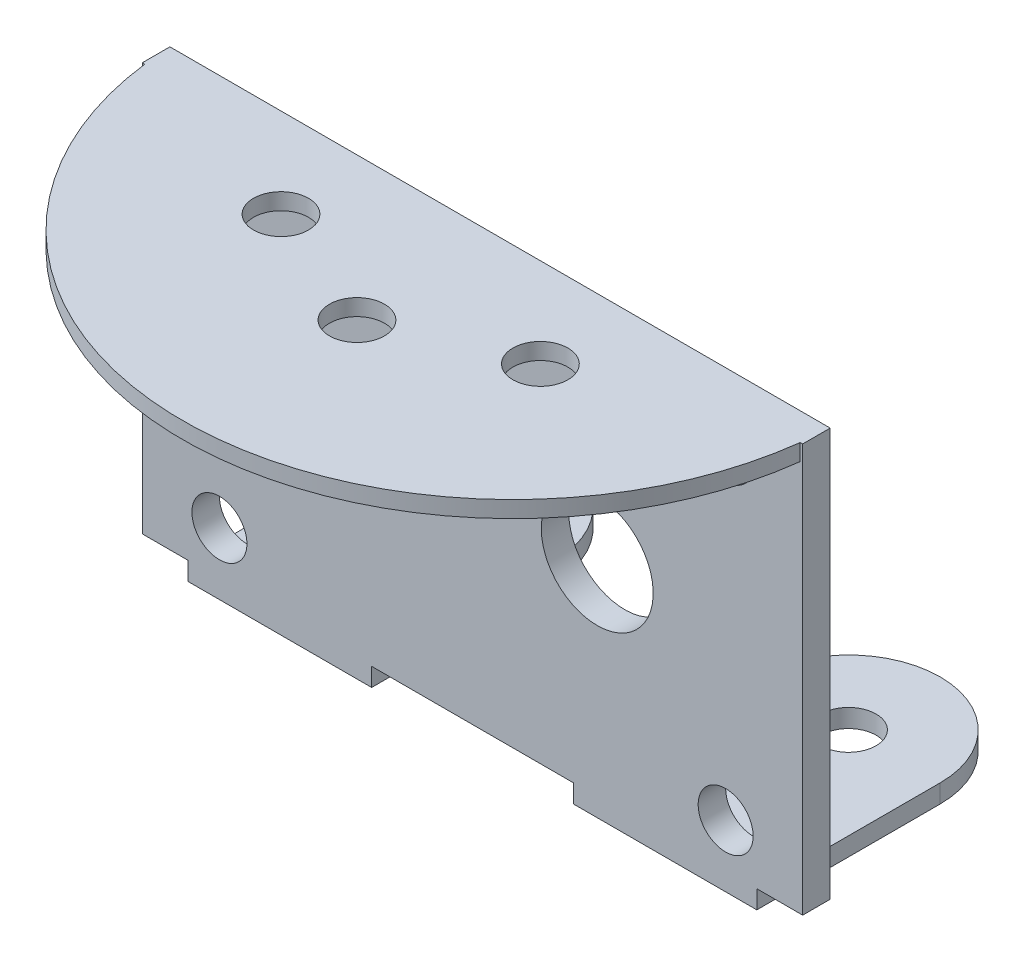
ISO-10303-21;
HEADER;
FILE_DESCRIPTION(('STEP AP214'),'2;1');
FILE_NAME('part.step','',(''),(''),'','','');
FILE_SCHEMA(('AUTOMOTIVE_DESIGN { 1 0 10303 214 1 1 1 1 }'));
ENDSEC;
DATA;
#1=APPLICATION_CONTEXT('core data for automotive mechanical design processes');
#2=APPLICATION_PROTOCOL_DEFINITION('international standard','automotive_design',2000,#1);
#3=PRODUCT_CONTEXT('',#1,'mechanical');
#4=PRODUCT('Part','Part','',(#3));
#5=PRODUCT_RELATED_PRODUCT_CATEGORY('part','',(#4));
#6=PRODUCT_DEFINITION_FORMATION('','',#4);
#7=PRODUCT_DEFINITION_CONTEXT('part definition',#1,'design');
#8=PRODUCT_DEFINITION('design','',#6,#7);
#9=PRODUCT_DEFINITION_SHAPE('','',#8);
#10=(LENGTH_UNIT() NAMED_UNIT(*) SI_UNIT(.MILLI.,.METRE.));
#11=(NAMED_UNIT(*) PLANE_ANGLE_UNIT() SI_UNIT($,.RADIAN.));
#12=(NAMED_UNIT(*) SI_UNIT($,.STERADIAN.) SOLID_ANGLE_UNIT());
#13=UNCERTAINTY_MEASURE_WITH_UNIT(LENGTH_MEASURE(1.E-05),#10,'distance_accuracy_value','');
#14=(GEOMETRIC_REPRESENTATION_CONTEXT(3) GLOBAL_UNCERTAINTY_ASSIGNED_CONTEXT((#13)) GLOBAL_UNIT_ASSIGNED_CONTEXT((#10,
#11,#12)) REPRESENTATION_CONTEXT('',''));
#15=CARTESIAN_POINT('',(0.,0.,0.));
#16=DIRECTION('',(0.,0.,1.));
#17=DIRECTION('',(1.,0.,0.));
#18=AXIS2_PLACEMENT_3D('',#15,#16,#17);
#19=CARTESIAN_POINT('',(13.8,8.74499999999999,1.5));
#20=DIRECTION('',(0.,0.,-1.));
#21=DIRECTION('',(-1.,0.,0.));
#22=AXIS2_PLACEMENT_3D('',#19,#20,#21);
#23=CYLINDRICAL_SURFACE('',#22,1.5);
#24=CARTESIAN_POINT('',(13.8,8.74499999999999,1.5));
#25=DIRECTION('',(0.,0.,1.));
#26=DIRECTION('',(1.,0.,0.));
#27=AXIS2_PLACEMENT_3D('',#24,#25,#26);
#28=CIRCLE('',#27,1.5);
#29=CARTESIAN_POINT('',(13.5558688876854,10.225,1.5));
#30=VERTEX_POINT('',#29);
#31=CARTESIAN_POINT('',(14.0441311123146,10.225,1.5));
#32=VERTEX_POINT('',#31);
#33=EDGE_CURVE('E323',#30,#32,#28,.T.);
#34=ORIENTED_EDGE('',*,*,#33,.T.);
#35=DIRECTION('',(0.,0.,-1.));
#36=VECTOR('',#35,1.);
#37=CARTESIAN_POINT('',(14.0441311123146,10.225,1.5));
#38=LINE('',#37,#36);
#39=CARTESIAN_POINT('',(14.0441311123146,10.225,0.));
#40=VERTEX_POINT('',#39);
#41=EDGE_CURVE('E209',#32,#40,#38,.T.);
#42=ORIENTED_EDGE('',*,*,#41,.T.);
#43=CARTESIAN_POINT('',(13.8,8.74499999999999,0.));
#44=DIRECTION('',(0.,0.,1.));
#45=DIRECTION('',(1.,0.,0.));
#46=AXIS2_PLACEMENT_3D('',#43,#44,#45);
#47=CIRCLE('',#46,1.5);
#48=CARTESIAN_POINT('',(13.5558688876854,10.225,0.));
#49=VERTEX_POINT('',#48);
#50=EDGE_CURVE('E320',#49,#40,#47,.T.);
#51=ORIENTED_EDGE('',*,*,#50,.F.);
#52=DIRECTION('',(0.,0.,-1.));
#53=VECTOR('',#52,1.);
#54=CARTESIAN_POINT('',(13.5558688876854,10.225,1.5));
#55=LINE('',#54,#53);
#56=EDGE_CURVE('E204',#49,#30,#55,.F.);
#57=ORIENTED_EDGE('',*,*,#56,.T.);
#58=EDGE_LOOP('',(#34,#42,#51,#57));
#59=FACE_BOUND('',#58,.T.);
#60=ADVANCED_FACE('F39',(#59),#23,.F.);
#61=CARTESIAN_POINT('',(-13.8,8.74499999999999,1.5));
#62=DIRECTION('',(0.,0.,-1.));
#63=DIRECTION('',(-1.,0.,0.));
#64=AXIS2_PLACEMENT_3D('',#61,#62,#63);
#65=CYLINDRICAL_SURFACE('',#64,1.5);
#66=CARTESIAN_POINT('',(-13.8,8.74499999999999,1.5));
#67=DIRECTION('',(0.,0.,1.));
#68=DIRECTION('',(-1.,0.,0.));
#69=AXIS2_PLACEMENT_3D('',#66,#67,#68);
#70=CIRCLE('',#69,1.5);
#71=CARTESIAN_POINT('',(-14.0441311123146,10.225,1.5));
#72=VERTEX_POINT('',#71);
#73=CARTESIAN_POINT('',(-13.5558688876854,10.225,1.5));
#74=VERTEX_POINT('',#73);
#75=EDGE_CURVE('E200',#72,#74,#70,.T.);
#76=ORIENTED_EDGE('',*,*,#75,.T.);
#77=DIRECTION('',(0.,0.,-1.));
#78=VECTOR('',#77,1.);
#79=CARTESIAN_POINT('',(-13.5558688876854,10.225,1.5));
#80=LINE('',#79,#78);
#81=CARTESIAN_POINT('',(-13.5558688876854,10.225,0.));
#82=VERTEX_POINT('',#81);
#83=EDGE_CURVE('E11',#74,#82,#80,.T.);
#84=ORIENTED_EDGE('',*,*,#83,.T.);
#85=CARTESIAN_POINT('',(-13.8,8.74499999999999,0.));
#86=DIRECTION('',(0.,0.,1.));
#87=DIRECTION('',(-1.,0.,0.));
#88=AXIS2_PLACEMENT_3D('',#85,#86,#87);
#89=CIRCLE('',#88,1.5);
#90=CARTESIAN_POINT('',(-14.0441311123146,10.225,0.));
#91=VERTEX_POINT('',#90);
#92=EDGE_CURVE('E298',#91,#82,#89,.T.);
#93=ORIENTED_EDGE('',*,*,#92,.F.);
#94=DIRECTION('',(0.,0.,-1.));
#95=VECTOR('',#94,1.);
#96=CARTESIAN_POINT('',(-14.0441311123146,10.225,1.5));
#97=LINE('',#96,#95);
#98=EDGE_CURVE('E47',#91,#72,#97,.F.);
#99=ORIENTED_EDGE('',*,*,#98,.T.);
#100=EDGE_LOOP('',(#76,#84,#93,#99));
#101=FACE_BOUND('',#100,.T.);
#102=ADVANCED_FACE('F405',(#101),#65,.F.);
#103=CARTESIAN_POINT('',(-18.,-11.125,1.5));
#104=DIRECTION('',(0.,1.,0.));
#105=DIRECTION('',(-1.,0.,0.));
#106=AXIS2_PLACEMENT_3D('',#103,#104,#105);
#107=PLANE('',#106);
#108=DIRECTION('',(0.,0.,1.));
#109=VECTOR('',#108,1.);
#110=CARTESIAN_POINT('',(15.5,-11.125,0.));
#111=LINE('',#110,#109);
#112=CARTESIAN_POINT('',(15.5,-11.125,0.));
#113=VERTEX_POINT('',#112);
#114=CARTESIAN_POINT('',(15.5,-11.125,1.5));
#115=VERTEX_POINT('',#114);
#116=EDGE_CURVE('E244',#113,#115,#111,.T.);
#117=ORIENTED_EDGE('',*,*,#116,.F.);
#118=DIRECTION('',(1.,0.,0.));
#119=VECTOR('',#118,1.);
#120=CARTESIAN_POINT('',(-18.,-11.125,0.));
#121=LINE('',#120,#119);
#122=CARTESIAN_POINT('',(18.,-11.125,0.));
#123=VERTEX_POINT('',#122);
#124=EDGE_CURVE('E348',#113,#123,#121,.T.);
#125=ORIENTED_EDGE('',*,*,#124,.T.);
#126=DIRECTION('',(0.,0.,-1.));
#127=VECTOR('',#126,1.);
#128=CARTESIAN_POINT('',(18.,-11.125,1.5));
#129=LINE('',#128,#127);
#130=CARTESIAN_POINT('',(18.,-11.125,1.5));
#131=VERTEX_POINT('',#130);
#132=EDGE_CURVE('E340',#131,#123,#129,.T.);
#133=ORIENTED_EDGE('',*,*,#132,.F.);
#134=DIRECTION('',(1.,0.,0.));
#135=VECTOR('',#134,1.);
#136=CARTESIAN_POINT('',(-18.,-11.125,1.5));
#137=LINE('',#136,#135);
#138=EDGE_CURVE('E62',#115,#131,#137,.T.);
#139=ORIENTED_EDGE('',*,*,#138,.F.);
#140=EDGE_LOOP('',(#117,#125,#133,#139));
#141=FACE_BOUND('',#140,.T.);
#142=ADVANCED_FACE('F410',(#141),#107,.F.);
#143=CARTESIAN_POINT('',(-5.49999999999999,-11.125,0.));
#144=VERTEX_POINT('',#143);
#145=CARTESIAN_POINT('',(5.50000000000001,-11.125,0.));
#146=VERTEX_POINT('',#145);
#147=EDGE_CURVE('E797',#144,#146,#121,.T.);
#148=ORIENTED_EDGE('',*,*,#147,.T.);
#149=DIRECTION('',(0.,0.,1.));
#150=VECTOR('',#149,1.);
#151=CARTESIAN_POINT('',(5.50000000000001,-11.125,0.));
#152=LINE('',#151,#150);
#153=CARTESIAN_POINT('',(5.50000000000001,-11.125,1.5));
#154=VERTEX_POINT('',#153);
#155=EDGE_CURVE('E237',#146,#154,#152,.T.);
#156=ORIENTED_EDGE('',*,*,#155,.T.);
#157=CARTESIAN_POINT('',(-5.49999999999999,-11.125,1.5));
#158=VERTEX_POINT('',#157);
#159=EDGE_CURVE('E341',#158,#154,#137,.T.);
#160=ORIENTED_EDGE('',*,*,#159,.F.);
#161=DIRECTION('',(0.,0.,1.));
#162=VECTOR('',#161,1.);
#163=CARTESIAN_POINT('',(-5.49999999999999,-11.125,0.));
#164=LINE('',#163,#162);
#165=EDGE_CURVE('E279',#144,#158,#164,.T.);
#166=ORIENTED_EDGE('',*,*,#165,.F.);
#167=EDGE_LOOP('',(#148,#156,#160,#166));
#168=FACE_BOUND('',#167,.T.);
#169=ADVANCED_FACE('F419',(#168),#107,.F.);
#170=CARTESIAN_POINT('',(0.,0.,1.5));
#171=DIRECTION('',(0.,0.,-1.));
#172=DIRECTION('',(-1.,0.,0.));
#173=AXIS2_PLACEMENT_3D('',#170,#171,#172);
#174=PLANE('',#173);
#175=CARTESIAN_POINT('',(13.8,-8.74499999999999,1.5));
#176=DIRECTION('',(0.,0.,1.));
#177=DIRECTION('',(-1.,0.,0.));
#178=AXIS2_PLACEMENT_3D('',#175,#176,#177);
#179=CIRCLE('',#178,1.5);
#180=CARTESIAN_POINT('',(12.3,-8.74499999999999,1.5));
#181=VERTEX_POINT('',#180);
#182=EDGE_CURVE('E317',#181,#181,#179,.T.);
#183=ORIENTED_EDGE('',*,*,#182,.F.);
#184=EDGE_LOOP('',(#183));
#185=FACE_BOUND('',#184,.T.);
#186=CARTESIAN_POINT('',(6.80000000000002,0.,1.5));
#187=DIRECTION('',(0.,0.,1.));
#188=DIRECTION('',(-1.,0.,0.));
#189=AXIS2_PLACEMENT_3D('',#186,#187,#188);
#190=CIRCLE('',#189,3.05);
#191=CARTESIAN_POINT('',(3.75000000000002,0.,1.5));
#192=VERTEX_POINT('',#191);
#193=EDGE_CURVE('E311',#192,#192,#190,.T.);
#194=ORIENTED_EDGE('',*,*,#193,.F.);
#195=EDGE_LOOP('',(#194));
#196=FACE_BOUND('',#195,.T.);
#197=CARTESIAN_POINT('',(-13.8,-8.745,1.5));
#198=DIRECTION('',(0.,0.,1.));
#199=DIRECTION('',(1.,0.,0.));
#200=AXIS2_PLACEMENT_3D('',#197,#198,#199);
#201=CIRCLE('',#200,1.5);
#202=CARTESIAN_POINT('',(-12.3,-8.745,1.5));
#203=VERTEX_POINT('',#202);
#204=EDGE_CURVE('E305',#203,#203,#201,.T.);
#205=ORIENTED_EDGE('',*,*,#204,.F.);
#206=EDGE_LOOP('',(#205));
#207=FACE_BOUND('',#206,.T.);
#208=DIRECTION('',(1.,0.,0.));
#209=VECTOR('',#208,1.);
#210=CARTESIAN_POINT('',(0.,10.225,1.5));
#211=LINE('',#210,#209);
#212=CARTESIAN_POINT('',(-17.8650496780726,10.225,1.5));
#213=VERTEX_POINT('',#212);
#214=EDGE_CURVE('E54',#213,#72,#211,.T.);
#215=ORIENTED_EDGE('',*,*,#214,.F.);
#216=DIRECTION('',(0.,1.,0.));
#217=VECTOR('',#216,1.);
#218=CARTESIAN_POINT('',(-17.8650496780726,10.225,1.5));
#219=LINE('',#218,#217);
#220=CARTESIAN_POINT('',(-17.8650496780726,11.125,1.5));
#221=VERTEX_POINT('',#220);
#222=EDGE_CURVE('E178',#213,#221,#219,.T.);
#223=ORIENTED_EDGE('',*,*,#222,.T.);
#224=DIRECTION('',(-1.,0.,0.));
#225=VECTOR('',#224,1.);
#226=CARTESIAN_POINT('',(-18.,11.125,1.5));
#227=LINE('',#226,#225);
#228=CARTESIAN_POINT('',(-18.,11.125,1.5));
#229=VERTEX_POINT('',#228);
#230=EDGE_CURVE('E330',#221,#229,#227,.T.);
#231=ORIENTED_EDGE('',*,*,#230,.T.);
#232=DIRECTION('',(0.,-1.,0.));
#233=VECTOR('',#232,1.);
#234=CARTESIAN_POINT('',(-18.,-11.125,1.5));
#235=LINE('',#234,#233);
#236=CARTESIAN_POINT('',(-18.,-11.125,1.5));
#237=VERTEX_POINT('',#236);
#238=EDGE_CURVE('E335',#229,#237,#235,.T.);
#239=ORIENTED_EDGE('',*,*,#238,.T.);
#240=CARTESIAN_POINT('',(-15.5,-11.125,1.5));
#241=VERTEX_POINT('',#240);
#242=EDGE_CURVE('E337',#237,#241,#137,.T.);
#243=ORIENTED_EDGE('',*,*,#242,.T.);
#244=DIRECTION('',(0.,1.,0.));
#245=VECTOR('',#244,1.);
#246=CARTESIAN_POINT('',(-15.5,-12.125,1.5));
#247=LINE('',#246,#245);
#248=CARTESIAN_POINT('',(-15.5,-12.125,1.5));
#249=VERTEX_POINT('',#248);
#250=EDGE_CURVE('E286',#249,#241,#247,.T.);
#251=ORIENTED_EDGE('',*,*,#250,.F.);
#252=DIRECTION('',(-1.,0.,0.));
#253=VECTOR('',#252,1.);
#254=CARTESIAN_POINT('',(0.,-12.125,1.5));
#255=LINE('',#254,#253);
#256=CARTESIAN_POINT('',(-5.49999999999999,-12.125,1.5));
#257=VERTEX_POINT('',#256);
#258=EDGE_CURVE('E264',#257,#249,#255,.T.);
#259=ORIENTED_EDGE('',*,*,#258,.F.);
#260=DIRECTION('',(0.,1.,0.));
#261=VECTOR('',#260,1.);
#262=CARTESIAN_POINT('',(-5.49999999999999,-12.125,1.5));
#263=LINE('',#262,#261);
#264=EDGE_CURVE('E289',#257,#158,#263,.T.);
#265=ORIENTED_EDGE('',*,*,#264,.T.);
#266=ORIENTED_EDGE('',*,*,#159,.T.);
#267=DIRECTION('',(0.,1.,0.));
#268=VECTOR('',#267,1.);
#269=CARTESIAN_POINT('',(5.50000000000001,-12.125,1.5));
#270=LINE('',#269,#268);
#271=CARTESIAN_POINT('',(5.50000000000001,-12.125,1.5));
#272=VERTEX_POINT('',#271);
#273=EDGE_CURVE('E234',#272,#154,#270,.T.);
#274=ORIENTED_EDGE('',*,*,#273,.F.);
#275=DIRECTION('',(-1.,0.,0.));
#276=VECTOR('',#275,1.);
#277=CARTESIAN_POINT('',(0.,-12.125,1.5));
#278=LINE('',#277,#276);
#279=CARTESIAN_POINT('',(15.5,-12.125,1.5));
#280=VERTEX_POINT('',#279);
#281=EDGE_CURVE('E232',#280,#272,#278,.T.);
#282=ORIENTED_EDGE('',*,*,#281,.F.);
#283=DIRECTION('',(0.,1.,0.));
#284=VECTOR('',#283,1.);
#285=CARTESIAN_POINT('',(15.5,-12.125,1.5));
#286=LINE('',#285,#284);
#287=EDGE_CURVE('E249',#280,#115,#286,.T.);
#288=ORIENTED_EDGE('',*,*,#287,.T.);
#289=ORIENTED_EDGE('',*,*,#138,.T.);
#290=DIRECTION('',(0.,1.,0.));
#291=VECTOR('',#290,1.);
#292=CARTESIAN_POINT('',(18.,-11.125,1.5));
#293=LINE('',#292,#291);
#294=CARTESIAN_POINT('',(18.,11.125,1.5));
#295=VERTEX_POINT('',#294);
#296=EDGE_CURVE('E327',#131,#295,#293,.T.);
#297=ORIENTED_EDGE('',*,*,#296,.T.);
#298=CARTESIAN_POINT('',(17.8650496780725,11.125,1.5));
#299=VERTEX_POINT('',#298);
#300=EDGE_CURVE('E332',#295,#299,#227,.T.);
#301=ORIENTED_EDGE('',*,*,#300,.T.);
#302=DIRECTION('',(0.,1.,0.));
#303=VECTOR('',#302,1.);
#304=CARTESIAN_POINT('',(17.8650496780725,10.225,1.5));
#305=LINE('',#304,#303);
#306=CARTESIAN_POINT('',(17.8650496780725,10.225,1.5));
#307=VERTEX_POINT('',#306);
#308=EDGE_CURVE('E187',#299,#307,#305,.F.);
#309=ORIENTED_EDGE('',*,*,#308,.T.);
#310=EDGE_CURVE('E191',#32,#307,#211,.T.);
#311=ORIENTED_EDGE('',*,*,#310,.F.);
#312=ORIENTED_EDGE('',*,*,#33,.F.);
#313=EDGE_CURVE('E201',#74,#30,#211,.T.);
#314=ORIENTED_EDGE('',*,*,#313,.F.);
#315=ORIENTED_EDGE('',*,*,#75,.F.);
#316=EDGE_LOOP('',(#215,#223,#231,#239,#243,#251,#259,#265,#266,#274,#282,#288,#289,#297,#301,
#309,#311,#312,#314,#315));
#317=FACE_BOUND('',#316,.T.);
#318=CARTESIAN_POINT('',(-4.19999999999998,0.,1.5));
#319=DIRECTION('',(0.,0.,1.));
#320=DIRECTION('',(-1.,0.,0.));
#321=AXIS2_PLACEMENT_3D('',#318,#319,#320);
#322=CIRCLE('',#321,1.875);
#323=CARTESIAN_POINT('',(-6.07499999999998,0.,1.5));
#324=VERTEX_POINT('',#323);
#325=EDGE_CURVE('E295',#324,#324,#322,.T.);
#326=ORIENTED_EDGE('',*,*,#325,.F.);
#327=EDGE_LOOP('',(#326));
#328=FACE_BOUND('',#327,.T.);
#329=ADVANCED_FACE('F196',(#185,#196,#207,#317,#328),#174,.F.);
#330=CARTESIAN_POINT('',(0.,0.,0.));
#331=DIRECTION('',(0.,0.,-1.));
#332=DIRECTION('',(-1.,0.,0.));
#333=AXIS2_PLACEMENT_3D('',#330,#331,#332);
#334=PLANE('',#333);
#335=DIRECTION('',(0.,-1.,0.));
#336=VECTOR('',#335,1.);
#337=CARTESIAN_POINT('',(-18.,-11.125,0.));
#338=LINE('',#337,#336);
#339=CARTESIAN_POINT('',(-18.,11.125,0.));
#340=VERTEX_POINT('',#339);
#341=CARTESIAN_POINT('',(-18.,-11.125,0.));
#342=VERTEX_POINT('',#341);
#343=EDGE_CURVE('E346',#340,#342,#338,.T.);
#344=ORIENTED_EDGE('',*,*,#343,.F.);
#345=DIRECTION('',(-1.,0.,0.));
#346=VECTOR('',#345,1.);
#347=CARTESIAN_POINT('',(-18.,11.125,0.));
#348=LINE('',#347,#346);
#349=CARTESIAN_POINT('',(18.,11.125,0.));
#350=VERTEX_POINT('',#349);
#351=EDGE_CURVE('E344',#350,#340,#348,.T.);
#352=ORIENTED_EDGE('',*,*,#351,.F.);
#353=DIRECTION('',(0.,1.,0.));
#354=VECTOR('',#353,1.);
#355=CARTESIAN_POINT('',(18.,-11.125,0.));
#356=LINE('',#355,#354);
#357=EDGE_CURVE('E325',#123,#350,#356,.T.);
#358=ORIENTED_EDGE('',*,*,#357,.F.);
#359=ORIENTED_EDGE('',*,*,#124,.F.);
#360=EDGE_CURVE('E793',#146,#113,#121,.T.);
#361=ORIENTED_EDGE('',*,*,#360,.F.);
#362=ORIENTED_EDGE('',*,*,#147,.F.);
#363=CARTESIAN_POINT('',(-15.5,-11.125,0.));
#364=VERTEX_POINT('',#363);
#365=EDGE_CURVE('E351',#364,#144,#121,.T.);
#366=ORIENTED_EDGE('',*,*,#365,.F.);
#367=EDGE_CURVE('E331',#342,#364,#121,.T.);
#368=ORIENTED_EDGE('',*,*,#367,.F.);
#369=EDGE_LOOP('',(#344,#352,#358,#359,#361,#362,#366,#368));
#370=FACE_BOUND('',#369,.T.);
#371=DIRECTION('',(-1.,0.,0.));
#372=VECTOR('',#371,1.);
#373=CARTESIAN_POINT('',(0.,10.225,0.));
#374=LINE('',#373,#372);
#375=EDGE_CURVE('E192',#82,#91,#374,.T.);
#376=ORIENTED_EDGE('',*,*,#375,.T.);
#377=ORIENTED_EDGE('',*,*,#92,.T.);
#378=EDGE_LOOP('',(#376,#377));
#379=FACE_BOUND('',#378,.T.);
#380=EDGE_CURVE('E202',#40,#49,#374,.T.);
#381=ORIENTED_EDGE('',*,*,#380,.T.);
#382=ORIENTED_EDGE('',*,*,#50,.T.);
#383=EDGE_LOOP('',(#381,#382));
#384=FACE_BOUND('',#383,.T.);
#385=CARTESIAN_POINT('',(6.80000000000002,0.,0.));
#386=DIRECTION('',(0.,0.,1.));
#387=DIRECTION('',(-1.,0.,0.));
#388=AXIS2_PLACEMENT_3D('',#385,#386,#387);
#389=CIRCLE('',#388,3.05);
#390=CARTESIAN_POINT('',(3.75000000000002,0.,0.));
#391=VERTEX_POINT('',#390);
#392=EDGE_CURVE('E308',#391,#391,#389,.T.);
#393=ORIENTED_EDGE('',*,*,#392,.T.);
#394=EDGE_LOOP('',(#393));
#395=FACE_BOUND('',#394,.T.);
#396=CARTESIAN_POINT('',(13.8,-8.74499999999999,0.));
#397=DIRECTION('',(0.,0.,1.));
#398=DIRECTION('',(-1.,0.,0.));
#399=AXIS2_PLACEMENT_3D('',#396,#397,#398);
#400=CIRCLE('',#399,1.5);
#401=CARTESIAN_POINT('',(12.3,-8.74499999999999,0.));
#402=VERTEX_POINT('',#401);
#403=EDGE_CURVE('E314',#402,#402,#400,.T.);
#404=ORIENTED_EDGE('',*,*,#403,.T.);
#405=EDGE_LOOP('',(#404));
#406=FACE_BOUND('',#405,.T.);
#407=CARTESIAN_POINT('',(-13.8,-8.745,0.));
#408=DIRECTION('',(0.,0.,1.));
#409=DIRECTION('',(1.,0.,0.));
#410=AXIS2_PLACEMENT_3D('',#407,#408,#409);
#411=CIRCLE('',#410,1.5);
#412=CARTESIAN_POINT('',(-12.3,-8.745,0.));
#413=VERTEX_POINT('',#412);
#414=EDGE_CURVE('E302',#413,#413,#411,.T.);
#415=ORIENTED_EDGE('',*,*,#414,.T.);
#416=EDGE_LOOP('',(#415));
#417=FACE_BOUND('',#416,.T.);
#418=CARTESIAN_POINT('',(-4.19999999999998,0.,0.));
#419=DIRECTION('',(0.,0.,1.));
#420=DIRECTION('',(-1.,0.,0.));
#421=AXIS2_PLACEMENT_3D('',#418,#419,#420);
#422=CIRCLE('',#421,1.875);
#423=CARTESIAN_POINT('',(-6.07499999999998,0.,0.));
#424=VERTEX_POINT('',#423);
#425=EDGE_CURVE('E294',#424,#424,#422,.T.);
#426=ORIENTED_EDGE('',*,*,#425,.T.);
#427=EDGE_LOOP('',(#426));
#428=FACE_BOUND('',#427,.T.);
#429=ADVANCED_FACE('F418',(#370,#379,#384,#395,#406,#417,#428),#334,.T.);
#430=CARTESIAN_POINT('',(18.,-11.125,1.5));
#431=DIRECTION('',(-1.,0.,0.));
#432=DIRECTION('',(0.,-1.,0.));
#433=AXIS2_PLACEMENT_3D('',#430,#431,#432);
#434=PLANE('',#433);
#435=ORIENTED_EDGE('',*,*,#357,.T.);
#436=DIRECTION('',(0.,0.,-1.));
#437=VECTOR('',#436,1.);
#438=CARTESIAN_POINT('',(18.,11.125,1.5));
#439=LINE('',#438,#437);
#440=EDGE_CURVE('E360',#295,#350,#439,.T.);
#441=ORIENTED_EDGE('',*,*,#440,.F.);
#442=ORIENTED_EDGE('',*,*,#296,.F.);
#443=ORIENTED_EDGE('',*,*,#132,.T.);
#444=EDGE_LOOP('',(#435,#441,#442,#443));
#445=FACE_BOUND('',#444,.T.);
#446=ADVANCED_FACE('F41',(#445),#434,.F.);
#447=CARTESIAN_POINT('',(-18.,11.125,1.5));
#448=DIRECTION('',(0.,-1.,0.));
#449=DIRECTION('',(1.,0.,0.));
#450=AXIS2_PLACEMENT_3D('',#447,#448,#449);
#451=PLANE('',#450);
#452=ORIENTED_EDGE('',*,*,#230,.F.);
#453=CARTESIAN_POINT('',(0.,11.125,-0.7));
#454=DIRECTION('',(0.,1.,0.));
#455=DIRECTION('',(-1.,0.,0.));
#456=AXIS2_PLACEMENT_3D('',#453,#454,#455);
#457=CIRCLE('',#456,18.);
#458=EDGE_CURVE('E183',#221,#299,#457,.T.);
#459=ORIENTED_EDGE('',*,*,#458,.T.);
#460=ORIENTED_EDGE('',*,*,#300,.F.);
#461=ORIENTED_EDGE('',*,*,#440,.T.);
#462=ORIENTED_EDGE('',*,*,#351,.T.);
#463=DIRECTION('',(0.,0.,-1.));
#464=VECTOR('',#463,1.);
#465=CARTESIAN_POINT('',(-18.,11.125,1.5));
#466=LINE('',#465,#464);
#467=EDGE_CURVE('E357',#229,#340,#466,.T.);
#468=ORIENTED_EDGE('',*,*,#467,.F.);
#469=EDGE_LOOP('',(#452,#459,#460,#461,#462,#468));
#470=FACE_BOUND('',#469,.T.);
#471=CARTESIAN_POINT('',(0.,11.125,7.8));
#472=DIRECTION('',(0.,1.,0.));
#473=DIRECTION('',(-1.,0.,0.));
#474=AXIS2_PLACEMENT_3D('',#471,#472,#473);
#475=CIRCLE('',#474,1.5);
#476=CARTESIAN_POINT('',(-1.5,11.125,7.8));
#477=VERTEX_POINT('',#476);
#478=EDGE_CURVE('E442',#477,#477,#475,.T.);
#479=ORIENTED_EDGE('',*,*,#478,.F.);
#480=EDGE_LOOP('',(#479));
#481=FACE_BOUND('',#480,.T.);
#482=CARTESIAN_POINT('',(-7.07106781186548,11.125,4.87106781186548));
#483=DIRECTION('',(0.,1.,0.));
#484=DIRECTION('',(-1.,0.,0.));
#485=AXIS2_PLACEMENT_3D('',#482,#483,#484);
#486=CIRCLE('',#485,1.50000000123648);
#487=CARTESIAN_POINT('',(-8.57106781310195,11.125,4.87106781186548));
#488=VERTEX_POINT('',#487);
#489=EDGE_CURVE('E446',#488,#488,#486,.T.);
#490=ORIENTED_EDGE('',*,*,#489,.F.);
#491=EDGE_LOOP('',(#490));
#492=FACE_BOUND('',#491,.T.);
#493=CARTESIAN_POINT('',(7.07106781186547,11.125,4.87106781186547));
#494=DIRECTION('',(0.,1.,0.));
#495=DIRECTION('',(-1.,0.,0.));
#496=AXIS2_PLACEMENT_3D('',#493,#494,#495);
#497=CIRCLE('',#496,1.50000000018634);
#498=CARTESIAN_POINT('',(5.57106781167913,11.125,4.87106781186547));
#499=VERTEX_POINT('',#498);
#500=EDGE_CURVE('E449',#499,#499,#497,.T.);
#501=ORIENTED_EDGE('',*,*,#500,.F.);
#502=EDGE_LOOP('',(#501));
#503=FACE_BOUND('',#502,.T.);
#504=ADVANCED_FACE('F429',(#470,#481,#492,#503),#451,.F.);
#505=CARTESIAN_POINT('',(-18.,-11.125,1.5));
#506=DIRECTION('',(1.,0.,0.));
#507=DIRECTION('',(0.,1.,0.));
#508=AXIS2_PLACEMENT_3D('',#505,#506,#507);
#509=PLANE('',#508);
#510=ORIENTED_EDGE('',*,*,#343,.T.);
#511=DIRECTION('',(0.,0.,-1.));
#512=VECTOR('',#511,1.);
#513=CARTESIAN_POINT('',(-18.,-11.125,1.5));
#514=LINE('',#513,#512);
#515=EDGE_CURVE('E354',#237,#342,#514,.T.);
#516=ORIENTED_EDGE('',*,*,#515,.F.);
#517=ORIENTED_EDGE('',*,*,#238,.F.);
#518=ORIENTED_EDGE('',*,*,#467,.T.);
#519=EDGE_LOOP('',(#510,#516,#517,#518));
#520=FACE_BOUND('',#519,.T.);
#521=ADVANCED_FACE('F427',(#520),#509,.F.);
#522=ORIENTED_EDGE('',*,*,#367,.T.);
#523=DIRECTION('',(0.,0.,1.));
#524=VECTOR('',#523,1.);
#525=CARTESIAN_POINT('',(-15.5,-11.125,0.));
#526=LINE('',#525,#524);
#527=EDGE_CURVE('E282',#364,#241,#526,.T.);
#528=ORIENTED_EDGE('',*,*,#527,.T.);
#529=ORIENTED_EDGE('',*,*,#242,.F.);
#530=ORIENTED_EDGE('',*,*,#515,.T.);
#531=EDGE_LOOP('',(#522,#528,#529,#530));
#532=FACE_BOUND('',#531,.T.);
#533=ADVANCED_FACE('F424',(#532),#107,.F.);
#534=CARTESIAN_POINT('',(13.8,-8.74499999999999,1.5));
#535=DIRECTION('',(0.,0.,-1.));
#536=DIRECTION('',(-1.,0.,0.));
#537=AXIS2_PLACEMENT_3D('',#534,#535,#536);
#538=CYLINDRICAL_SURFACE('',#537,1.5);
#539=ORIENTED_EDGE('',*,*,#182,.T.);
#540=EDGE_LOOP('',(#539));
#541=FACE_BOUND('',#540,.T.);
#542=ORIENTED_EDGE('',*,*,#403,.F.);
#543=EDGE_LOOP('',(#542));
#544=FACE_BOUND('',#543,.T.);
#545=ADVANCED_FACE('F414',(#541,#544),#538,.F.);
#546=CARTESIAN_POINT('',(6.80000000000002,0.,1.5));
#547=DIRECTION('',(0.,0.,-1.));
#548=DIRECTION('',(-1.,0.,0.));
#549=AXIS2_PLACEMENT_3D('',#546,#547,#548);
#550=CYLINDRICAL_SURFACE('',#549,3.05);
#551=ORIENTED_EDGE('',*,*,#193,.T.);
#552=EDGE_LOOP('',(#551));
#553=FACE_BOUND('',#552,.T.);
#554=ORIENTED_EDGE('',*,*,#392,.F.);
#555=EDGE_LOOP('',(#554));
#556=FACE_BOUND('',#555,.T.);
#557=ADVANCED_FACE('F527',(#553,#556),#550,.F.);
#558=CARTESIAN_POINT('',(-13.8,-8.745,1.5));
#559=DIRECTION('',(0.,0.,-1.));
#560=DIRECTION('',(-1.,0.,0.));
#561=AXIS2_PLACEMENT_3D('',#558,#559,#560);
#562=CYLINDRICAL_SURFACE('',#561,1.5);
#563=ORIENTED_EDGE('',*,*,#204,.T.);
#564=EDGE_LOOP('',(#563));
#565=FACE_BOUND('',#564,.T.);
#566=ORIENTED_EDGE('',*,*,#414,.F.);
#567=EDGE_LOOP('',(#566));
#568=FACE_BOUND('',#567,.T.);
#569=ADVANCED_FACE('F519',(#565,#568),#562,.F.);
#570=CARTESIAN_POINT('',(-4.19999999999998,0.,1.5));
#571=DIRECTION('',(0.,0.,-1.));
#572=DIRECTION('',(-1.,0.,0.));
#573=AXIS2_PLACEMENT_3D('',#570,#571,#572);
#574=CYLINDRICAL_SURFACE('',#573,1.875);
#575=ORIENTED_EDGE('',*,*,#325,.T.);
#576=EDGE_LOOP('',(#575));
#577=FACE_BOUND('',#576,.T.);
#578=ORIENTED_EDGE('',*,*,#425,.F.);
#579=EDGE_LOOP('',(#578));
#580=FACE_BOUND('',#579,.T.);
#581=ADVANCED_FACE('F512',(#577,#580),#574,.F.);
#582=CARTESIAN_POINT('',(0.,-11.125,0.));
#583=DIRECTION('',(0.,-1.,0.));
#584=DIRECTION('',(1.,0.,0.));
#585=AXIS2_PLACEMENT_3D('',#582,#583,#584);
#586=PLANE('',#585);
#587=CARTESIAN_POINT('',(-10.5,-11.125,-8.5));
#588=DIRECTION('',(0.,-1.,0.));
#589=DIRECTION('',(1.,0.,0.));
#590=AXIS2_PLACEMENT_3D('',#587,#588,#589);
#591=CIRCLE('',#590,1.5);
#592=CARTESIAN_POINT('',(-8.99999999999999,-11.125,-8.5));
#593=VERTEX_POINT('',#592);
#594=EDGE_CURVE('E262',#593,#593,#591,.F.);
#595=ORIENTED_EDGE('',*,*,#594,.F.);
#596=EDGE_LOOP('',(#595));
#597=FACE_BOUND('',#596,.T.);
#598=CARTESIAN_POINT('',(-15.5,-11.125,-8.5));
#599=VERTEX_POINT('',#598);
#600=EDGE_CURVE('E278',#599,#364,#526,.T.);
#601=ORIENTED_EDGE('',*,*,#600,.T.);
#602=ORIENTED_EDGE('',*,*,#365,.T.);
#603=CARTESIAN_POINT('',(-5.49999999999999,-11.125,-8.5));
#604=VERTEX_POINT('',#603);
#605=EDGE_CURVE('E275',#604,#144,#164,.T.);
#606=ORIENTED_EDGE('',*,*,#605,.F.);
#607=CARTESIAN_POINT('',(-10.5,-11.125,-8.5));
#608=DIRECTION('',(0.,-1.,0.));
#609=DIRECTION('',(1.,0.,0.));
#610=AXIS2_PLACEMENT_3D('',#607,#608,#609);
#611=CIRCLE('',#610,5.);
#612=EDGE_CURVE('E257',#604,#599,#611,.F.);
#613=ORIENTED_EDGE('',*,*,#612,.T.);
#614=EDGE_LOOP('',(#601,#602,#606,#613));
#615=FACE_BOUND('',#614,.T.);
#616=ADVANCED_FACE('F389',(#597,#615),#586,.F.);
#617=CARTESIAN_POINT('',(-10.5,-12.125,-8.5));
#618=DIRECTION('',(0.,1.,0.));
#619=DIRECTION('',(-1.,0.,0.));
#620=AXIS2_PLACEMENT_3D('',#617,#618,#619);
#621=CYLINDRICAL_SURFACE('',#620,5.);
#622=ORIENTED_EDGE('',*,*,#612,.F.);
#623=DIRECTION('',(0.,1.,0.));
#624=VECTOR('',#623,1.);
#625=CARTESIAN_POINT('',(-5.49999999999999,-12.125,-8.5));
#626=LINE('',#625,#624);
#627=CARTESIAN_POINT('',(-5.49999999999999,-12.125,-8.5));
#628=VERTEX_POINT('',#627);
#629=EDGE_CURVE('E292',#628,#604,#626,.T.);
#630=ORIENTED_EDGE('',*,*,#629,.F.);
#631=CARTESIAN_POINT('',(-10.5,-12.125,-8.5));
#632=DIRECTION('',(0.,-1.,0.));
#633=DIRECTION('',(1.,0.,0.));
#634=AXIS2_PLACEMENT_3D('',#631,#632,#633);
#635=CIRCLE('',#634,5.);
#636=CARTESIAN_POINT('',(-15.5,-12.125,-8.5));
#637=VERTEX_POINT('',#636);
#638=EDGE_CURVE('E258',#628,#637,#635,.F.);
#639=ORIENTED_EDGE('',*,*,#638,.T.);
#640=DIRECTION('',(0.,1.,0.));
#641=VECTOR('',#640,1.);
#642=CARTESIAN_POINT('',(-15.5,-12.125,-8.5));
#643=LINE('',#642,#641);
#644=EDGE_CURVE('E272',#637,#599,#643,.T.);
#645=ORIENTED_EDGE('',*,*,#644,.T.);
#646=EDGE_LOOP('',(#622,#630,#639,#645));
#647=FACE_BOUND('',#646,.T.);
#648=ADVANCED_FACE('F391',(#647),#621,.T.);
#649=CARTESIAN_POINT('',(-5.49999999999999,-12.125,0.));
#650=DIRECTION('',(-1.,0.,0.));
#651=DIRECTION('',(0.,-1.,0.));
#652=AXIS2_PLACEMENT_3D('',#649,#650,#651);
#653=PLANE('',#652);
#654=ORIENTED_EDGE('',*,*,#605,.T.);
#655=ORIENTED_EDGE('',*,*,#165,.T.);
#656=ORIENTED_EDGE('',*,*,#264,.F.);
#657=DIRECTION('',(0.,0.,1.));
#658=VECTOR('',#657,1.);
#659=CARTESIAN_POINT('',(-5.49999999999999,-12.125,0.));
#660=LINE('',#659,#658);
#661=EDGE_CURVE('E261',#628,#257,#660,.T.);
#662=ORIENTED_EDGE('',*,*,#661,.F.);
#663=ORIENTED_EDGE('',*,*,#629,.T.);
#664=EDGE_LOOP('',(#654,#655,#656,#662,#663));
#665=FACE_BOUND('',#664,.T.);
#666=ADVANCED_FACE('F370',(#665),#653,.F.);
#667=CARTESIAN_POINT('',(-15.5,-12.125,0.));
#668=DIRECTION('',(-1.,0.,0.));
#669=DIRECTION('',(0.,0.,1.));
#670=AXIS2_PLACEMENT_3D('',#667,#668,#669);
#671=PLANE('',#670);
#672=ORIENTED_EDGE('',*,*,#600,.F.);
#673=ORIENTED_EDGE('',*,*,#644,.F.);
#674=DIRECTION('',(0.,0.,1.));
#675=VECTOR('',#674,1.);
#676=CARTESIAN_POINT('',(-15.5,-12.125,0.));
#677=LINE('',#676,#675);
#678=EDGE_CURVE('E266',#637,#249,#677,.T.);
#679=ORIENTED_EDGE('',*,*,#678,.T.);
#680=ORIENTED_EDGE('',*,*,#250,.T.);
#681=ORIENTED_EDGE('',*,*,#527,.F.);
#682=EDGE_LOOP('',(#672,#673,#679,#680,#681));
#683=FACE_BOUND('',#682,.T.);
#684=ADVANCED_FACE('F393',(#683),#671,.T.);
#685=CARTESIAN_POINT('',(-10.5,-12.125,-8.5));
#686=DIRECTION('',(0.,1.,0.));
#687=DIRECTION('',(-1.,0.,0.));
#688=AXIS2_PLACEMENT_3D('',#685,#686,#687);
#689=CYLINDRICAL_SURFACE('',#688,1.5);
#690=CARTESIAN_POINT('',(-10.5,-12.125,-8.5));
#691=DIRECTION('',(0.,-1.,0.));
#692=DIRECTION('',(1.,0.,0.));
#693=AXIS2_PLACEMENT_3D('',#690,#691,#692);
#694=CIRCLE('',#693,1.5);
#695=CARTESIAN_POINT('',(-8.99999999999999,-12.125,-8.5));
#696=VERTEX_POINT('',#695);
#697=EDGE_CURVE('E269',#696,#696,#694,.F.);
#698=ORIENTED_EDGE('',*,*,#697,.F.);
#699=EDGE_LOOP('',(#698));
#700=FACE_BOUND('',#699,.T.);
#701=ORIENTED_EDGE('',*,*,#594,.T.);
#702=EDGE_LOOP('',(#701));
#703=FACE_BOUND('',#702,.T.);
#704=ADVANCED_FACE('F395',(#700,#703),#689,.F.);
#705=CARTESIAN_POINT('',(0.,-12.125,0.));
#706=DIRECTION('',(0.,-1.,0.));
#707=DIRECTION('',(1.,0.,0.));
#708=AXIS2_PLACEMENT_3D('',#705,#706,#707);
#709=PLANE('',#708);
#710=ORIENTED_EDGE('',*,*,#638,.F.);
#711=ORIENTED_EDGE('',*,*,#661,.T.);
#712=ORIENTED_EDGE('',*,*,#258,.T.);
#713=ORIENTED_EDGE('',*,*,#678,.F.);
#714=EDGE_LOOP('',(#710,#711,#712,#713));
#715=FACE_BOUND('',#714,.T.);
#716=ORIENTED_EDGE('',*,*,#697,.T.);
#717=EDGE_LOOP('',(#716));
#718=FACE_BOUND('',#717,.T.);
#719=ADVANCED_FACE('F383',(#715,#718),#709,.T.);
#720=CARTESIAN_POINT('',(5.50000000000001,-12.125,0.));
#721=DIRECTION('',(-1.,0.,0.));
#722=DIRECTION('',(0.,-1.,0.));
#723=AXIS2_PLACEMENT_3D('',#720,#721,#722);
#724=PLANE('',#723);
#725=CARTESIAN_POINT('',(5.50000000000001,-11.125,-8.5));
#726=VERTEX_POINT('',#725);
#727=EDGE_CURVE('E238',#726,#146,#152,.T.);
#728=ORIENTED_EDGE('',*,*,#727,.F.);
#729=DIRECTION('',(0.,1.,0.));
#730=VECTOR('',#729,1.);
#731=CARTESIAN_POINT('',(5.50000000000001,-12.125,-8.5));
#732=LINE('',#731,#730);
#733=CARTESIAN_POINT('',(5.50000000000001,-12.125,-8.5));
#734=VERTEX_POINT('',#733);
#735=EDGE_CURVE('E255',#734,#726,#732,.T.);
#736=ORIENTED_EDGE('',*,*,#735,.F.);
#737=DIRECTION('',(0.,0.,1.));
#738=VECTOR('',#737,1.);
#739=CARTESIAN_POINT('',(5.50000000000001,-12.125,0.));
#740=LINE('',#739,#738);
#741=EDGE_CURVE('E222',#734,#272,#740,.T.);
#742=ORIENTED_EDGE('',*,*,#741,.T.);
#743=ORIENTED_EDGE('',*,*,#273,.T.);
#744=ORIENTED_EDGE('',*,*,#155,.F.);
#745=EDGE_LOOP('',(#728,#736,#742,#743,#744));
#746=FACE_BOUND('',#745,.T.);
#747=ADVANCED_FACE('F501',(#746),#724,.T.);
#748=CARTESIAN_POINT('',(10.5,-12.125,-8.5));
#749=DIRECTION('',(0.,1.,0.));
#750=DIRECTION('',(-1.,0.,0.));
#751=AXIS2_PLACEMENT_3D('',#748,#749,#750);
#752=CYLINDRICAL_SURFACE('',#751,5.);
#753=CARTESIAN_POINT('',(10.5,-11.125,-8.5));
#754=DIRECTION('',(0.,-1.,0.));
#755=DIRECTION('',(1.,0.,0.));
#756=AXIS2_PLACEMENT_3D('',#753,#754,#755);
#757=CIRCLE('',#756,5.);
#758=CARTESIAN_POINT('',(15.5,-11.125,-8.5));
#759=VERTEX_POINT('',#758);
#760=EDGE_CURVE('E241',#726,#759,#757,.T.);
#761=ORIENTED_EDGE('',*,*,#760,.T.);
#762=DIRECTION('',(0.,1.,0.));
#763=VECTOR('',#762,1.);
#764=CARTESIAN_POINT('',(15.5,-12.125,-8.5));
#765=LINE('',#764,#763);
#766=CARTESIAN_POINT('',(15.5,-12.125,-8.5));
#767=VERTEX_POINT('',#766);
#768=EDGE_CURVE('E252',#767,#759,#765,.T.);
#769=ORIENTED_EDGE('',*,*,#768,.F.);
#770=CARTESIAN_POINT('',(10.5,-12.125,-8.5));
#771=DIRECTION('',(0.,-1.,0.));
#772=DIRECTION('',(1.,0.,0.));
#773=AXIS2_PLACEMENT_3D('',#770,#771,#772);
#774=CIRCLE('',#773,5.);
#775=EDGE_CURVE('E226',#734,#767,#774,.T.);
#776=ORIENTED_EDGE('',*,*,#775,.F.);
#777=ORIENTED_EDGE('',*,*,#735,.T.);
#778=EDGE_LOOP('',(#761,#769,#776,#777));
#779=FACE_BOUND('',#778,.T.);
#780=ADVANCED_FACE('F497',(#779),#752,.T.);
#781=CARTESIAN_POINT('',(15.5,-12.125,0.));
#782=DIRECTION('',(-1.,0.,0.));
#783=DIRECTION('',(0.,0.,1.));
#784=AXIS2_PLACEMENT_3D('',#781,#782,#783);
#785=PLANE('',#784);
#786=EDGE_CURVE('E223',#759,#113,#111,.T.);
#787=ORIENTED_EDGE('',*,*,#786,.T.);
#788=ORIENTED_EDGE('',*,*,#116,.T.);
#789=ORIENTED_EDGE('',*,*,#287,.F.);
#790=DIRECTION('',(0.,0.,1.));
#791=VECTOR('',#790,1.);
#792=CARTESIAN_POINT('',(15.5,-12.125,0.));
#793=LINE('',#792,#791);
#794=EDGE_CURVE('E229',#767,#280,#793,.T.);
#795=ORIENTED_EDGE('',*,*,#794,.F.);
#796=ORIENTED_EDGE('',*,*,#768,.T.);
#797=EDGE_LOOP('',(#787,#788,#789,#795,#796));
#798=FACE_BOUND('',#797,.T.);
#799=ADVANCED_FACE('F494',(#798),#785,.F.);
#800=CARTESIAN_POINT('',(10.5,-12.125,-8.5));
#801=DIRECTION('',(0.,1.,0.));
#802=DIRECTION('',(-1.,0.,0.));
#803=AXIS2_PLACEMENT_3D('',#800,#801,#802);
#804=CYLINDRICAL_SURFACE('',#803,1.5);
#805=CARTESIAN_POINT('',(10.5,-12.125,-8.5));
#806=DIRECTION('',(0.,-1.,0.));
#807=DIRECTION('',(1.,0.,0.));
#808=AXIS2_PLACEMENT_3D('',#805,#806,#807);
#809=CIRCLE('',#808,1.5);
#810=CARTESIAN_POINT('',(12.,-12.125,-8.5));
#811=VERTEX_POINT('',#810);
#812=EDGE_CURVE('E219',#811,#811,#809,.T.);
#813=ORIENTED_EDGE('',*,*,#812,.T.);
#814=EDGE_LOOP('',(#813));
#815=FACE_BOUND('',#814,.T.);
#816=CARTESIAN_POINT('',(10.5,-11.125,-8.5));
#817=DIRECTION('',(0.,-1.,0.));
#818=DIRECTION('',(1.,0.,0.));
#819=AXIS2_PLACEMENT_3D('',#816,#817,#818);
#820=CIRCLE('',#819,1.5);
#821=CARTESIAN_POINT('',(12.,-11.125,-8.5));
#822=VERTEX_POINT('',#821);
#823=EDGE_CURVE('E186',#822,#822,#820,.T.);
#824=ORIENTED_EDGE('',*,*,#823,.F.);
#825=EDGE_LOOP('',(#824));
#826=FACE_BOUND('',#825,.T.);
#827=ADVANCED_FACE('F489',(#815,#826),#804,.F.);
#828=CARTESIAN_POINT('',(0.,-12.125,0.));
#829=DIRECTION('',(0.,-1.,0.));
#830=DIRECTION('',(1.,0.,0.));
#831=AXIS2_PLACEMENT_3D('',#828,#829,#830);
#832=PLANE('',#831);
#833=ORIENTED_EDGE('',*,*,#812,.F.);
#834=EDGE_LOOP('',(#833));
#835=FACE_BOUND('',#834,.T.);
#836=ORIENTED_EDGE('',*,*,#741,.F.);
#837=ORIENTED_EDGE('',*,*,#775,.T.);
#838=ORIENTED_EDGE('',*,*,#794,.T.);
#839=ORIENTED_EDGE('',*,*,#281,.T.);
#840=EDGE_LOOP('',(#836,#837,#838,#839));
#841=FACE_BOUND('',#840,.T.);
#842=ADVANCED_FACE('F485',(#835,#841),#832,.T.);
#843=CARTESIAN_POINT('',(0.,-11.125,0.));
#844=DIRECTION('',(0.,-1.,0.));
#845=DIRECTION('',(1.,0.,0.));
#846=AXIS2_PLACEMENT_3D('',#843,#844,#845);
#847=PLANE('',#846);
#848=ORIENTED_EDGE('',*,*,#360,.T.);
#849=ORIENTED_EDGE('',*,*,#786,.F.);
#850=ORIENTED_EDGE('',*,*,#760,.F.);
#851=ORIENTED_EDGE('',*,*,#727,.T.);
#852=EDGE_LOOP('',(#848,#849,#850,#851));
#853=FACE_BOUND('',#852,.T.);
#854=ORIENTED_EDGE('',*,*,#823,.T.);
#855=EDGE_LOOP('',(#854));
#856=FACE_BOUND('',#855,.T.);
#857=ADVANCED_FACE('F488',(#853,#856),#847,.F.);
#858=CARTESIAN_POINT('',(0.,10.225,-0.7));
#859=DIRECTION('',(0.,1.,0.));
#860=DIRECTION('',(-1.,0.,0.));
#861=AXIS2_PLACEMENT_3D('',#858,#859,#860);
#862=CYLINDRICAL_SURFACE('',#861,18.);
#863=ORIENTED_EDGE('',*,*,#222,.F.);
#864=CARTESIAN_POINT('',(0.,10.225,-0.7));
#865=DIRECTION('',(0.,1.,0.));
#866=DIRECTION('',(-1.,0.,0.));
#867=AXIS2_PLACEMENT_3D('',#864,#865,#866);
#868=CIRCLE('',#867,18.);
#869=EDGE_CURVE('E180',#213,#307,#868,.T.);
#870=ORIENTED_EDGE('',*,*,#869,.T.);
#871=ORIENTED_EDGE('',*,*,#308,.F.);
#872=ORIENTED_EDGE('',*,*,#458,.F.);
#873=EDGE_LOOP('',(#863,#870,#871,#872));
#874=FACE_BOUND('',#873,.T.);
#875=ADVANCED_FACE('F179',(#874),#862,.T.);
#876=CARTESIAN_POINT('',(0.,10.225,0.));
#877=DIRECTION('',(0.,1.,0.));
#878=DIRECTION('',(-1.,0.,0.));
#879=AXIS2_PLACEMENT_3D('',#876,#877,#878);
#880=PLANE('',#879);
#881=CARTESIAN_POINT('',(7.07106781186547,10.225,4.87106781186547));
#882=DIRECTION('',(0.,1.,0.));
#883=DIRECTION('',(-1.,0.,0.));
#884=AXIS2_PLACEMENT_3D('',#881,#882,#883);
#885=CIRCLE('',#884,1.50000000018634);
#886=CARTESIAN_POINT('',(5.57106781167913,10.225,4.87106781186547));
#887=VERTEX_POINT('',#886);
#888=EDGE_CURVE('E454',#887,#887,#885,.T.);
#889=ORIENTED_EDGE('',*,*,#888,.T.);
#890=EDGE_LOOP('',(#889));
#891=FACE_BOUND('',#890,.T.);
#892=CARTESIAN_POINT('',(-7.07106781186548,10.225,4.87106781186548));
#893=DIRECTION('',(0.,1.,0.));
#894=DIRECTION('',(-1.,0.,0.));
#895=AXIS2_PLACEMENT_3D('',#892,#893,#894);
#896=CIRCLE('',#895,1.50000000123648);
#897=CARTESIAN_POINT('',(-8.57106781310195,10.225,4.87106781186548));
#898=VERTEX_POINT('',#897);
#899=EDGE_CURVE('E456',#898,#898,#896,.T.);
#900=ORIENTED_EDGE('',*,*,#899,.T.);
#901=EDGE_LOOP('',(#900));
#902=FACE_BOUND('',#901,.T.);
#903=CARTESIAN_POINT('',(0.,10.225,7.8));
#904=DIRECTION('',(0.,1.,0.));
#905=DIRECTION('',(-1.,0.,0.));
#906=AXIS2_PLACEMENT_3D('',#903,#904,#905);
#907=CIRCLE('',#906,1.5);
#908=CARTESIAN_POINT('',(-1.5,10.225,7.8));
#909=VERTEX_POINT('',#908);
#910=EDGE_CURVE('E193',#909,#909,#907,.T.);
#911=ORIENTED_EDGE('',*,*,#910,.T.);
#912=EDGE_LOOP('',(#911));
#913=FACE_BOUND('',#912,.T.);
#914=ORIENTED_EDGE('',*,*,#41,.F.);
#915=ORIENTED_EDGE('',*,*,#310,.T.);
#916=ORIENTED_EDGE('',*,*,#869,.F.);
#917=ORIENTED_EDGE('',*,*,#214,.T.);
#918=ORIENTED_EDGE('',*,*,#98,.F.);
#919=ORIENTED_EDGE('',*,*,#375,.F.);
#920=ORIENTED_EDGE('',*,*,#83,.F.);
#921=ORIENTED_EDGE('',*,*,#313,.T.);
#922=ORIENTED_EDGE('',*,*,#56,.F.);
#923=ORIENTED_EDGE('',*,*,#380,.F.);
#924=EDGE_LOOP('',(#914,#915,#916,#917,#918,#919,#920,#921,#922,#923));
#925=FACE_BOUND('',#924,.T.);
#926=ADVANCED_FACE('F189',(#891,#902,#913,#925),#880,.F.);
#927=CARTESIAN_POINT('',(0.,10.225,7.8));
#928=DIRECTION('',(0.,1.,0.));
#929=DIRECTION('',(-1.,0.,0.));
#930=AXIS2_PLACEMENT_3D('',#927,#928,#929);
#931=CYLINDRICAL_SURFACE('',#930,1.5);
#932=ORIENTED_EDGE('',*,*,#910,.F.);
#933=EDGE_LOOP('',(#932));
#934=FACE_BOUND('',#933,.T.);
#935=ORIENTED_EDGE('',*,*,#478,.T.);
#936=EDGE_LOOP('',(#935));
#937=FACE_BOUND('',#936,.T.);
#938=ADVANCED_FACE('F467',(#934,#937),#931,.F.);
#939=CARTESIAN_POINT('',(-7.07106781186548,10.225,4.87106781186548));
#940=DIRECTION('',(0.,1.,0.));
#941=DIRECTION('',(-1.,0.,0.));
#942=AXIS2_PLACEMENT_3D('',#939,#940,#941);
#943=CYLINDRICAL_SURFACE('',#942,1.50000000123648);
#944=ORIENTED_EDGE('',*,*,#899,.F.);
#945=EDGE_LOOP('',(#944));
#946=FACE_BOUND('',#945,.T.);
#947=ORIENTED_EDGE('',*,*,#489,.T.);
#948=EDGE_LOOP('',(#947));
#949=FACE_BOUND('',#948,.T.);
#950=ADVANCED_FACE('F470',(#946,#949),#943,.F.);
#951=CARTESIAN_POINT('',(7.07106781186547,10.225,4.87106781186547));
#952=DIRECTION('',(0.,1.,0.));
#953=DIRECTION('',(-1.,0.,0.));
#954=AXIS2_PLACEMENT_3D('',#951,#952,#953);
#955=CYLINDRICAL_SURFACE('',#954,1.50000000018634);
#956=ORIENTED_EDGE('',*,*,#888,.F.);
#957=EDGE_LOOP('',(#956));
#958=FACE_BOUND('',#957,.T.);
#959=ORIENTED_EDGE('',*,*,#500,.T.);
#960=EDGE_LOOP('',(#959));
#961=FACE_BOUND('',#960,.T.);
#962=ADVANCED_FACE('F476',(#958,#961),#955,.F.);
#963=CLOSED_SHELL('',(#60,#102,#142,#169,#329,#429,#446,#504,#521,#533,#545,#557,#569,#581,#616,
#648,#666,#684,#704,#719,#747,#780,#799,#827,#842,#857,#875,#926,#938,#950,#962));
#964=MANIFOLD_SOLID_BREP('B2',#963);
#965=ADVANCED_BREP_SHAPE_REPRESENTATION('',(#18,#964),#14);
#966=SHAPE_DEFINITION_REPRESENTATION(#9,#965);
ENDSEC;
END-ISO-10303-21;
